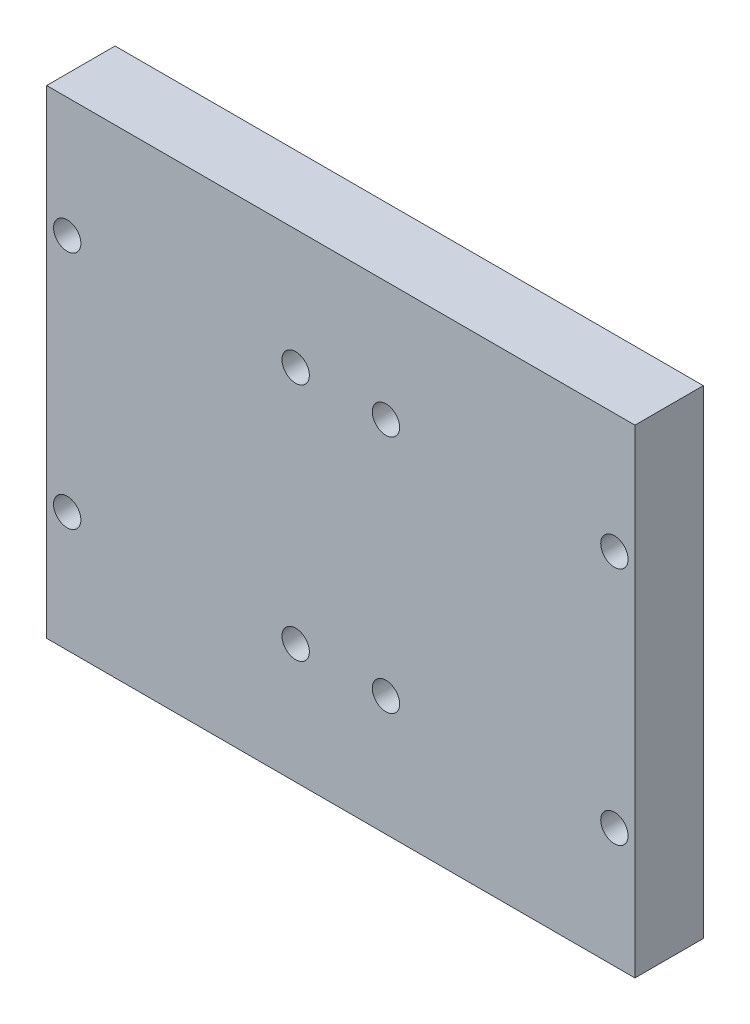
ISO-10303-21;
HEADER;
FILE_DESCRIPTION(('STEP AP214'),'2;1');
FILE_NAME('part.step','',(''),(''),'','','');
FILE_SCHEMA(('AUTOMOTIVE_DESIGN { 1 0 10303 214 1 1 1 1 }'));
ENDSEC;
DATA;
#1=APPLICATION_CONTEXT('core data for automotive mechanical design processes');
#2=APPLICATION_PROTOCOL_DEFINITION('international standard','automotive_design',2000,#1);
#3=PRODUCT_CONTEXT('',#1,'mechanical');
#4=PRODUCT('Part','Part','',(#3));
#5=PRODUCT_RELATED_PRODUCT_CATEGORY('part','',(#4));
#6=PRODUCT_DEFINITION_FORMATION('','',#4);
#7=PRODUCT_DEFINITION_CONTEXT('part definition',#1,'design');
#8=PRODUCT_DEFINITION('design','',#6,#7);
#9=PRODUCT_DEFINITION_SHAPE('','',#8);
#10=(LENGTH_UNIT() NAMED_UNIT(*) SI_UNIT(.MILLI.,.METRE.));
#11=(NAMED_UNIT(*) PLANE_ANGLE_UNIT() SI_UNIT($,.RADIAN.));
#12=(NAMED_UNIT(*) SI_UNIT($,.STERADIAN.) SOLID_ANGLE_UNIT());
#13=UNCERTAINTY_MEASURE_WITH_UNIT(LENGTH_MEASURE(1.E-05),#10,'distance_accuracy_value','');
#14=(GEOMETRIC_REPRESENTATION_CONTEXT(3) GLOBAL_UNCERTAINTY_ASSIGNED_CONTEXT((#13)) GLOBAL_UNIT_ASSIGNED_CONTEXT((#10,
#11,#12)) REPRESENTATION_CONTEXT('',''));
#15=CARTESIAN_POINT('',(0.,0.,0.));
#16=DIRECTION('',(0.,0.,1.));
#17=DIRECTION('',(1.,0.,0.));
#18=AXIS2_PLACEMENT_3D('',#15,#16,#17);
#19=CARTESIAN_POINT('',(0.,0.,10.));
#20=DIRECTION('',(0.,0.,1.));
#21=DIRECTION('',(1.,0.,0.));
#22=AXIS2_PLACEMENT_3D('',#19,#20,#21);
#23=PLANE('',#22);
#24=CARTESIAN_POINT('',(83.,-17.5,10.));
#25=DIRECTION('',(0.,0.,1.));
#26=DIRECTION('',(-1.,0.,0.));
#27=AXIS2_PLACEMENT_3D('',#24,#25,#26);
#28=CIRCLE('',#27,2.00000000000001);
#29=CARTESIAN_POINT('',(81.,-17.5,10.));
#30=VERTEX_POINT('',#29);
#31=EDGE_CURVE('E144',#30,#30,#28,.T.);
#32=ORIENTED_EDGE('',*,*,#31,.F.);
#33=EDGE_LOOP('',(#32));
#34=FACE_BOUND('',#33,.T.);
#35=CARTESIAN_POINT('',(49.6,-52.5,10.));
#36=DIRECTION('',(0.,0.,1.));
#37=DIRECTION('',(-1.,0.,0.));
#38=AXIS2_PLACEMENT_3D('',#35,#36,#37);
#39=CIRCLE('',#38,2.00000000000001);
#40=CARTESIAN_POINT('',(47.6,-52.5,10.));
#41=VERTEX_POINT('',#40);
#42=EDGE_CURVE('E132',#41,#41,#39,.T.);
#43=ORIENTED_EDGE('',*,*,#42,.F.);
#44=EDGE_LOOP('',(#43));
#45=FACE_BOUND('',#44,.T.);
#46=CARTESIAN_POINT('',(36.4,-52.5,10.));
#47=DIRECTION('',(0.,0.,1.));
#48=DIRECTION('',(1.,0.,0.));
#49=AXIS2_PLACEMENT_3D('',#46,#47,#48);
#50=CIRCLE('',#49,2.);
#51=CARTESIAN_POINT('',(38.4,-52.5,10.));
#52=VERTEX_POINT('',#51);
#53=EDGE_CURVE('E120',#52,#52,#50,.T.);
#54=ORIENTED_EDGE('',*,*,#53,.F.);
#55=EDGE_LOOP('',(#54));
#56=FACE_BOUND('',#55,.T.);
#57=CARTESIAN_POINT('',(3.,-17.5,10.));
#58=DIRECTION('',(0.,0.,1.));
#59=DIRECTION('',(1.,0.,0.));
#60=AXIS2_PLACEMENT_3D('',#57,#58,#59);
#61=CIRCLE('',#60,2.);
#62=CARTESIAN_POINT('',(5.,-17.5,10.));
#63=VERTEX_POINT('',#62);
#64=EDGE_CURVE('E99',#63,#63,#61,.T.);
#65=ORIENTED_EDGE('',*,*,#64,.F.);
#66=EDGE_LOOP('',(#65));
#67=FACE_BOUND('',#66,.T.);
#68=DIRECTION('',(0.,-1.,0.));
#69=VECTOR('',#68,1.);
#70=CARTESIAN_POINT('',(0.,0.,10.));
#71=LINE('',#70,#69);
#72=CARTESIAN_POINT('',(0.,0.,10.));
#73=VERTEX_POINT('',#72);
#74=CARTESIAN_POINT('',(0.,-70.,10.));
#75=VERTEX_POINT('',#74);
#76=EDGE_CURVE('E84',#73,#75,#71,.T.);
#77=ORIENTED_EDGE('',*,*,#76,.T.);
#78=DIRECTION('',(1.,0.,0.));
#79=VECTOR('',#78,1.);
#80=CARTESIAN_POINT('',(0.,-70.,10.));
#81=LINE('',#80,#79);
#82=CARTESIAN_POINT('',(86.,-70.,10.));
#83=VERTEX_POINT('',#82);
#84=EDGE_CURVE('E79',#75,#83,#81,.T.);
#85=ORIENTED_EDGE('',*,*,#84,.T.);
#86=DIRECTION('',(0.,1.,0.));
#87=VECTOR('',#86,1.);
#88=CARTESIAN_POINT('',(86.,0.,10.));
#89=LINE('',#88,#87);
#90=CARTESIAN_POINT('',(86.,0.,10.));
#91=VERTEX_POINT('',#90);
#92=EDGE_CURVE('E82',#83,#91,#89,.T.);
#93=ORIENTED_EDGE('',*,*,#92,.T.);
#94=DIRECTION('',(-1.,0.,0.));
#95=VECTOR('',#94,1.);
#96=CARTESIAN_POINT('',(0.,0.,10.));
#97=LINE('',#96,#95);
#98=EDGE_CURVE('E49',#91,#73,#97,.T.);
#99=ORIENTED_EDGE('',*,*,#98,.T.);
#100=EDGE_LOOP('',(#77,#85,#93,#99));
#101=FACE_BOUND('',#100,.T.);
#102=CARTESIAN_POINT('',(3.00000000000001,-52.5,10.));
#103=DIRECTION('',(0.,0.,1.));
#104=DIRECTION('',(1.,0.,0.));
#105=AXIS2_PLACEMENT_3D('',#102,#103,#104);
#106=CIRCLE('',#105,2.);
#107=CARTESIAN_POINT('',(5.00000000000001,-52.5,10.));
#108=VERTEX_POINT('',#107);
#109=EDGE_CURVE('E114',#108,#108,#106,.T.);
#110=ORIENTED_EDGE('',*,*,#109,.F.);
#111=EDGE_LOOP('',(#110));
#112=FACE_BOUND('',#111,.T.);
#113=CARTESIAN_POINT('',(36.4,-17.5,10.));
#114=DIRECTION('',(0.,0.,1.));
#115=DIRECTION('',(1.,0.,0.));
#116=AXIS2_PLACEMENT_3D('',#113,#114,#115);
#117=CIRCLE('',#116,2.);
#118=CARTESIAN_POINT('',(38.4,-17.5,10.));
#119=VERTEX_POINT('',#118);
#120=EDGE_CURVE('E126',#119,#119,#117,.T.);
#121=ORIENTED_EDGE('',*,*,#120,.F.);
#122=EDGE_LOOP('',(#121));
#123=FACE_BOUND('',#122,.T.);
#124=CARTESIAN_POINT('',(83.,-52.5,10.));
#125=DIRECTION('',(0.,0.,1.));
#126=DIRECTION('',(-1.,0.,0.));
#127=AXIS2_PLACEMENT_3D('',#124,#125,#126);
#128=CIRCLE('',#127,2.00000000000001);
#129=CARTESIAN_POINT('',(81.,-52.5,10.));
#130=VERTEX_POINT('',#129);
#131=EDGE_CURVE('E138',#130,#130,#128,.T.);
#132=ORIENTED_EDGE('',*,*,#131,.F.);
#133=EDGE_LOOP('',(#132));
#134=FACE_BOUND('',#133,.T.);
#135=CARTESIAN_POINT('',(49.6,-17.5,10.));
#136=DIRECTION('',(0.,0.,1.));
#137=DIRECTION('',(-1.,0.,0.));
#138=AXIS2_PLACEMENT_3D('',#135,#136,#137);
#139=CIRCLE('',#138,2.);
#140=CARTESIAN_POINT('',(47.6,-17.5,10.));
#141=VERTEX_POINT('',#140);
#142=EDGE_CURVE('E150',#141,#141,#139,.T.);
#143=ORIENTED_EDGE('',*,*,#142,.F.);
#144=EDGE_LOOP('',(#143));
#145=FACE_BOUND('',#144,.T.);
#146=ADVANCED_FACE('F32',(#34,#45,#56,#67,#101,#112,#123,#134,#145),#23,.T.);
#147=CARTESIAN_POINT('',(0.,0.,0.));
#148=DIRECTION('',(0.,0.,1.));
#149=DIRECTION('',(1.,0.,0.));
#150=AXIS2_PLACEMENT_3D('',#147,#148,#149);
#151=PLANE('',#150);
#152=DIRECTION('',(0.,-1.,0.));
#153=VECTOR('',#152,1.);
#154=CARTESIAN_POINT('',(0.,0.,0.));
#155=LINE('',#154,#153);
#156=CARTESIAN_POINT('',(0.,0.,0.));
#157=VERTEX_POINT('',#156);
#158=CARTESIAN_POINT('',(0.,-70.,0.));
#159=VERTEX_POINT('',#158);
#160=EDGE_CURVE('E96',#157,#159,#155,.T.);
#161=ORIENTED_EDGE('',*,*,#160,.F.);
#162=DIRECTION('',(-1.,0.,0.));
#163=VECTOR('',#162,1.);
#164=CARTESIAN_POINT('',(0.,0.,0.));
#165=LINE('',#164,#163);
#166=CARTESIAN_POINT('',(86.,0.,0.));
#167=VERTEX_POINT('',#166);
#168=EDGE_CURVE('E72',#167,#157,#165,.T.);
#169=ORIENTED_EDGE('',*,*,#168,.F.);
#170=DIRECTION('',(0.,1.,0.));
#171=VECTOR('',#170,1.);
#172=CARTESIAN_POINT('',(86.,0.,0.));
#173=LINE('',#172,#171);
#174=CARTESIAN_POINT('',(86.,-70.,0.));
#175=VERTEX_POINT('',#174);
#176=EDGE_CURVE('E66',#175,#167,#173,.T.);
#177=ORIENTED_EDGE('',*,*,#176,.F.);
#178=DIRECTION('',(1.,0.,0.));
#179=VECTOR('',#178,1.);
#180=CARTESIAN_POINT('',(0.,-70.,0.));
#181=LINE('',#180,#179);
#182=EDGE_CURVE('E88',#159,#175,#181,.T.);
#183=ORIENTED_EDGE('',*,*,#182,.F.);
#184=EDGE_LOOP('',(#161,#169,#177,#183));
#185=FACE_BOUND('',#184,.T.);
#186=CARTESIAN_POINT('',(3.,-17.5,0.));
#187=DIRECTION('',(0.,0.,1.));
#188=DIRECTION('',(1.,0.,0.));
#189=AXIS2_PLACEMENT_3D('',#186,#187,#188);
#190=CIRCLE('',#189,2.);
#191=CARTESIAN_POINT('',(5.,-17.5,0.));
#192=VERTEX_POINT('',#191);
#193=EDGE_CURVE('E111',#192,#192,#190,.T.);
#194=ORIENTED_EDGE('',*,*,#193,.T.);
#195=EDGE_LOOP('',(#194));
#196=FACE_BOUND('',#195,.T.);
#197=CARTESIAN_POINT('',(3.00000000000001,-52.5,0.));
#198=DIRECTION('',(0.,0.,1.));
#199=DIRECTION('',(1.,0.,0.));
#200=AXIS2_PLACEMENT_3D('',#197,#198,#199);
#201=CIRCLE('',#200,2.);
#202=CARTESIAN_POINT('',(5.00000000000001,-52.5,0.));
#203=VERTEX_POINT('',#202);
#204=EDGE_CURVE('E117',#203,#203,#201,.T.);
#205=ORIENTED_EDGE('',*,*,#204,.T.);
#206=EDGE_LOOP('',(#205));
#207=FACE_BOUND('',#206,.T.);
#208=CARTESIAN_POINT('',(36.4,-52.5,0.));
#209=DIRECTION('',(0.,0.,1.));
#210=DIRECTION('',(1.,0.,0.));
#211=AXIS2_PLACEMENT_3D('',#208,#209,#210);
#212=CIRCLE('',#211,2.);
#213=CARTESIAN_POINT('',(38.4,-52.5,0.));
#214=VERTEX_POINT('',#213);
#215=EDGE_CURVE('E123',#214,#214,#212,.T.);
#216=ORIENTED_EDGE('',*,*,#215,.T.);
#217=EDGE_LOOP('',(#216));
#218=FACE_BOUND('',#217,.T.);
#219=CARTESIAN_POINT('',(36.4,-17.5,0.));
#220=DIRECTION('',(0.,0.,1.));
#221=DIRECTION('',(1.,0.,0.));
#222=AXIS2_PLACEMENT_3D('',#219,#220,#221);
#223=CIRCLE('',#222,2.);
#224=CARTESIAN_POINT('',(38.4,-17.5,0.));
#225=VERTEX_POINT('',#224);
#226=EDGE_CURVE('E129',#225,#225,#223,.T.);
#227=ORIENTED_EDGE('',*,*,#226,.T.);
#228=EDGE_LOOP('',(#227));
#229=FACE_BOUND('',#228,.T.);
#230=CARTESIAN_POINT('',(49.6,-52.5,0.));
#231=DIRECTION('',(0.,0.,1.));
#232=DIRECTION('',(-1.,0.,0.));
#233=AXIS2_PLACEMENT_3D('',#230,#231,#232);
#234=CIRCLE('',#233,2.00000000000001);
#235=CARTESIAN_POINT('',(47.6,-52.5,0.));
#236=VERTEX_POINT('',#235);
#237=EDGE_CURVE('E135',#236,#236,#234,.T.);
#238=ORIENTED_EDGE('',*,*,#237,.T.);
#239=EDGE_LOOP('',(#238));
#240=FACE_BOUND('',#239,.T.);
#241=CARTESIAN_POINT('',(83.,-52.5,0.));
#242=DIRECTION('',(0.,0.,1.));
#243=DIRECTION('',(-1.,0.,0.));
#244=AXIS2_PLACEMENT_3D('',#241,#242,#243);
#245=CIRCLE('',#244,2.00000000000001);
#246=CARTESIAN_POINT('',(81.,-52.5,0.));
#247=VERTEX_POINT('',#246);
#248=EDGE_CURVE('E141',#247,#247,#245,.T.);
#249=ORIENTED_EDGE('',*,*,#248,.T.);
#250=EDGE_LOOP('',(#249));
#251=FACE_BOUND('',#250,.T.);
#252=CARTESIAN_POINT('',(83.,-17.5,0.));
#253=DIRECTION('',(0.,0.,1.));
#254=DIRECTION('',(-1.,0.,0.));
#255=AXIS2_PLACEMENT_3D('',#252,#253,#254);
#256=CIRCLE('',#255,2.00000000000001);
#257=CARTESIAN_POINT('',(81.,-17.5,0.));
#258=VERTEX_POINT('',#257);
#259=EDGE_CURVE('E147',#258,#258,#256,.T.);
#260=ORIENTED_EDGE('',*,*,#259,.T.);
#261=EDGE_LOOP('',(#260));
#262=FACE_BOUND('',#261,.T.);
#263=CARTESIAN_POINT('',(49.6,-17.5,0.));
#264=DIRECTION('',(0.,0.,1.));
#265=DIRECTION('',(-1.,0.,0.));
#266=AXIS2_PLACEMENT_3D('',#263,#264,#265);
#267=CIRCLE('',#266,2.);
#268=CARTESIAN_POINT('',(47.6,-17.5,0.));
#269=VERTEX_POINT('',#268);
#270=EDGE_CURVE('E153',#269,#269,#267,.T.);
#271=ORIENTED_EDGE('',*,*,#270,.T.);
#272=EDGE_LOOP('',(#271));
#273=FACE_BOUND('',#272,.T.);
#274=ADVANCED_FACE('F107',(#185,#196,#207,#218,#229,#240,#251,#262,#273),#151,.F.);
#275=CARTESIAN_POINT('',(0.,0.,10.));
#276=DIRECTION('',(1.,0.,0.));
#277=DIRECTION('',(0.,1.,0.));
#278=AXIS2_PLACEMENT_3D('',#275,#276,#277);
#279=PLANE('',#278);
#280=ORIENTED_EDGE('',*,*,#160,.T.);
#281=DIRECTION('',(0.,0.,-1.));
#282=VECTOR('',#281,1.);
#283=CARTESIAN_POINT('',(0.,-70.,10.));
#284=LINE('',#283,#282);
#285=EDGE_CURVE('E11',#75,#159,#284,.T.);
#286=ORIENTED_EDGE('',*,*,#285,.F.);
#287=ORIENTED_EDGE('',*,*,#76,.F.);
#288=DIRECTION('',(0.,0.,-1.));
#289=VECTOR('',#288,1.);
#290=CARTESIAN_POINT('',(0.,0.,10.));
#291=LINE('',#290,#289);
#292=EDGE_CURVE('E92',#73,#157,#291,.T.);
#293=ORIENTED_EDGE('',*,*,#292,.T.);
#294=EDGE_LOOP('',(#280,#286,#287,#293));
#295=FACE_BOUND('',#294,.T.);
#296=ADVANCED_FACE('F34',(#295),#279,.F.);
#297=CARTESIAN_POINT('',(0.,-70.,10.));
#298=DIRECTION('',(0.,1.,0.));
#299=DIRECTION('',(-1.,0.,0.));
#300=AXIS2_PLACEMENT_3D('',#297,#298,#299);
#301=PLANE('',#300);
#302=ORIENTED_EDGE('',*,*,#182,.T.);
#303=DIRECTION('',(0.,0.,-1.));
#304=VECTOR('',#303,1.);
#305=CARTESIAN_POINT('',(86.,-70.,10.));
#306=LINE('',#305,#304);
#307=EDGE_CURVE('E41',#83,#175,#306,.T.);
#308=ORIENTED_EDGE('',*,*,#307,.F.);
#309=ORIENTED_EDGE('',*,*,#84,.F.);
#310=ORIENTED_EDGE('',*,*,#285,.T.);
#311=EDGE_LOOP('',(#302,#308,#309,#310));
#312=FACE_BOUND('',#311,.T.);
#313=ADVANCED_FACE('F87',(#312),#301,.F.);
#314=CARTESIAN_POINT('',(86.,0.,10.));
#315=DIRECTION('',(-1.,0.,0.));
#316=DIRECTION('',(0.,-1.,0.));
#317=AXIS2_PLACEMENT_3D('',#314,#315,#316);
#318=PLANE('',#317);
#319=ORIENTED_EDGE('',*,*,#176,.T.);
#320=DIRECTION('',(0.,0.,-1.));
#321=VECTOR('',#320,1.);
#322=CARTESIAN_POINT('',(86.,0.,10.));
#323=LINE('',#322,#321);
#324=EDGE_CURVE('E89',#91,#167,#323,.T.);
#325=ORIENTED_EDGE('',*,*,#324,.F.);
#326=ORIENTED_EDGE('',*,*,#92,.F.);
#327=ORIENTED_EDGE('',*,*,#307,.T.);
#328=EDGE_LOOP('',(#319,#325,#326,#327));
#329=FACE_BOUND('',#328,.T.);
#330=ADVANCED_FACE('F90',(#329),#318,.F.);
#331=CARTESIAN_POINT('',(0.,0.,10.));
#332=DIRECTION('',(0.,-1.,0.));
#333=DIRECTION('',(1.,0.,0.));
#334=AXIS2_PLACEMENT_3D('',#331,#332,#333);
#335=PLANE('',#334);
#336=ORIENTED_EDGE('',*,*,#168,.T.);
#337=ORIENTED_EDGE('',*,*,#292,.F.);
#338=ORIENTED_EDGE('',*,*,#98,.F.);
#339=ORIENTED_EDGE('',*,*,#324,.T.);
#340=EDGE_LOOP('',(#336,#337,#338,#339));
#341=FACE_BOUND('',#340,.T.);
#342=ADVANCED_FACE('F104',(#341),#335,.F.);
#343=CARTESIAN_POINT('',(3.,-17.5,10.));
#344=DIRECTION('',(0.,0.,-1.));
#345=DIRECTION('',(-1.,0.,0.));
#346=AXIS2_PLACEMENT_3D('',#343,#344,#345);
#347=CYLINDRICAL_SURFACE('',#346,2.);
#348=ORIENTED_EDGE('',*,*,#64,.T.);
#349=EDGE_LOOP('',(#348));
#350=FACE_BOUND('',#349,.T.);
#351=ORIENTED_EDGE('',*,*,#193,.F.);
#352=EDGE_LOOP('',(#351));
#353=FACE_BOUND('',#352,.T.);
#354=ADVANCED_FACE('F172',(#350,#353),#347,.F.);
#355=CARTESIAN_POINT('',(3.00000000000001,-52.5,10.));
#356=DIRECTION('',(0.,0.,-1.));
#357=DIRECTION('',(-1.,0.,0.));
#358=AXIS2_PLACEMENT_3D('',#355,#356,#357);
#359=CYLINDRICAL_SURFACE('',#358,2.);
#360=ORIENTED_EDGE('',*,*,#109,.T.);
#361=EDGE_LOOP('',(#360));
#362=FACE_BOUND('',#361,.T.);
#363=ORIENTED_EDGE('',*,*,#204,.F.);
#364=EDGE_LOOP('',(#363));
#365=FACE_BOUND('',#364,.T.);
#366=ADVANCED_FACE('F218',(#362,#365),#359,.F.);
#367=CARTESIAN_POINT('',(36.4,-52.5,10.));
#368=DIRECTION('',(0.,0.,-1.));
#369=DIRECTION('',(-1.,0.,0.));
#370=AXIS2_PLACEMENT_3D('',#367,#368,#369);
#371=CYLINDRICAL_SURFACE('',#370,2.);
#372=ORIENTED_EDGE('',*,*,#53,.T.);
#373=EDGE_LOOP('',(#372));
#374=FACE_BOUND('',#373,.T.);
#375=ORIENTED_EDGE('',*,*,#215,.F.);
#376=EDGE_LOOP('',(#375));
#377=FACE_BOUND('',#376,.T.);
#378=ADVANCED_FACE('F226',(#374,#377),#371,.F.);
#379=CARTESIAN_POINT('',(36.4,-17.5,10.));
#380=DIRECTION('',(0.,0.,-1.));
#381=DIRECTION('',(-1.,0.,0.));
#382=AXIS2_PLACEMENT_3D('',#379,#380,#381);
#383=CYLINDRICAL_SURFACE('',#382,2.);
#384=ORIENTED_EDGE('',*,*,#120,.T.);
#385=EDGE_LOOP('',(#384));
#386=FACE_BOUND('',#385,.T.);
#387=ORIENTED_EDGE('',*,*,#226,.F.);
#388=EDGE_LOOP('',(#387));
#389=FACE_BOUND('',#388,.T.);
#390=ADVANCED_FACE('F234',(#386,#389),#383,.F.);
#391=CARTESIAN_POINT('',(49.6,-52.5,10.));
#392=DIRECTION('',(0.,0.,-1.));
#393=DIRECTION('',(-1.,0.,0.));
#394=AXIS2_PLACEMENT_3D('',#391,#392,#393);
#395=CYLINDRICAL_SURFACE('',#394,2.00000000000001);
#396=ORIENTED_EDGE('',*,*,#42,.T.);
#397=EDGE_LOOP('',(#396));
#398=FACE_BOUND('',#397,.T.);
#399=ORIENTED_EDGE('',*,*,#237,.F.);
#400=EDGE_LOOP('',(#399));
#401=FACE_BOUND('',#400,.T.);
#402=ADVANCED_FACE('F243',(#398,#401),#395,.F.);
#403=CARTESIAN_POINT('',(83.,-52.5,10.));
#404=DIRECTION('',(0.,0.,-1.));
#405=DIRECTION('',(-1.,0.,0.));
#406=AXIS2_PLACEMENT_3D('',#403,#404,#405);
#407=CYLINDRICAL_SURFACE('',#406,2.00000000000001);
#408=ORIENTED_EDGE('',*,*,#131,.T.);
#409=EDGE_LOOP('',(#408));
#410=FACE_BOUND('',#409,.T.);
#411=ORIENTED_EDGE('',*,*,#248,.F.);
#412=EDGE_LOOP('',(#411));
#413=FACE_BOUND('',#412,.T.);
#414=ADVANCED_FACE('F252',(#410,#413),#407,.F.);
#415=CARTESIAN_POINT('',(83.,-17.5,10.));
#416=DIRECTION('',(0.,0.,-1.));
#417=DIRECTION('',(-1.,0.,0.));
#418=AXIS2_PLACEMENT_3D('',#415,#416,#417);
#419=CYLINDRICAL_SURFACE('',#418,2.00000000000001);
#420=ORIENTED_EDGE('',*,*,#31,.T.);
#421=EDGE_LOOP('',(#420));
#422=FACE_BOUND('',#421,.T.);
#423=ORIENTED_EDGE('',*,*,#259,.F.);
#424=EDGE_LOOP('',(#423));
#425=FACE_BOUND('',#424,.T.);
#426=ADVANCED_FACE('F261',(#422,#425),#419,.F.);
#427=CARTESIAN_POINT('',(49.6,-17.5,10.));
#428=DIRECTION('',(0.,0.,-1.));
#429=DIRECTION('',(-1.,0.,0.));
#430=AXIS2_PLACEMENT_3D('',#427,#428,#429);
#431=CYLINDRICAL_SURFACE('',#430,2.);
#432=ORIENTED_EDGE('',*,*,#142,.T.);
#433=EDGE_LOOP('',(#432));
#434=FACE_BOUND('',#433,.T.);
#435=ORIENTED_EDGE('',*,*,#270,.F.);
#436=EDGE_LOOP('',(#435));
#437=FACE_BOUND('',#436,.T.);
#438=ADVANCED_FACE('F159',(#434,#437),#431,.F.);
#439=CLOSED_SHELL('',(#146,#274,#296,#313,#330,#342,#354,#366,#378,#390,#402,#414,#426,#438));
#440=MANIFOLD_SOLID_BREP('B2',#439);
#441=ADVANCED_BREP_SHAPE_REPRESENTATION('',(#18,#440),#14);
#442=SHAPE_DEFINITION_REPRESENTATION(#9,#441);
ENDSEC;
END-ISO-10303-21;
